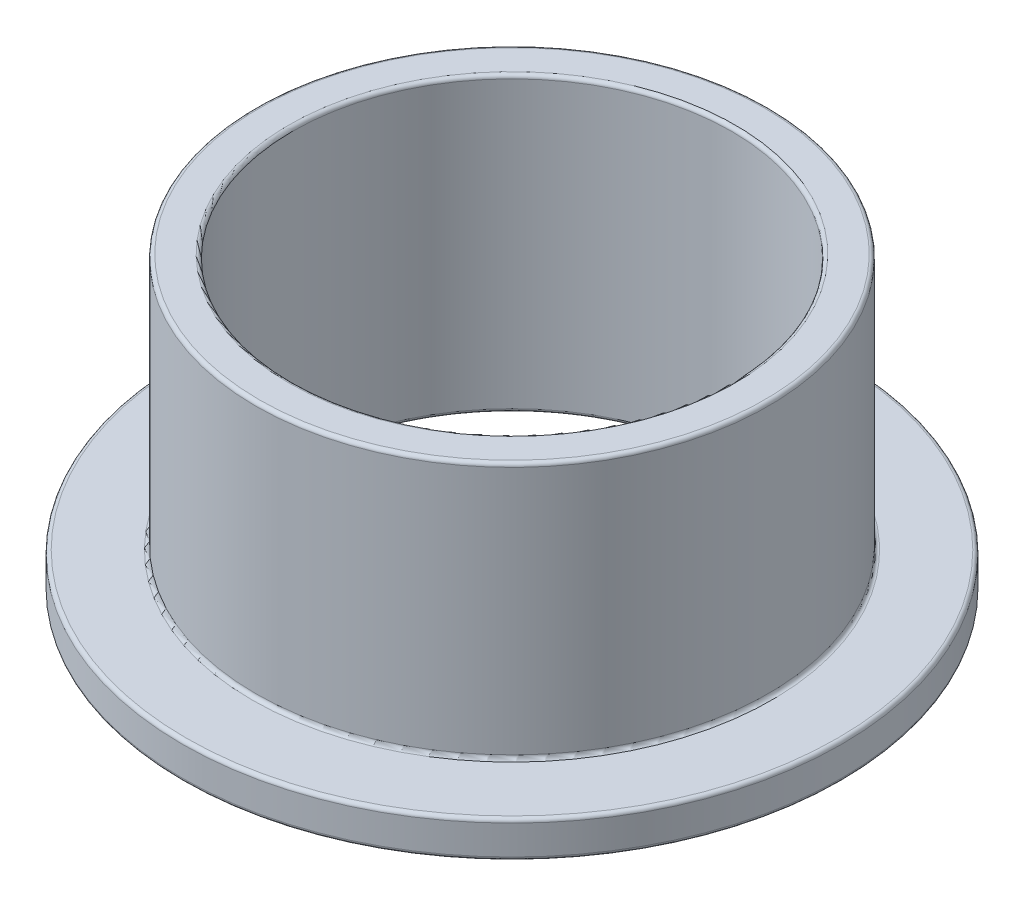
ISO-10303-21;
HEADER;
FILE_DESCRIPTION(('STEP AP214'),'2;1');
FILE_NAME('part.step','',(''),(''),'','','');
FILE_SCHEMA(('AUTOMOTIVE_DESIGN { 1 0 10303 214 1 1 1 1 }'));
ENDSEC;
DATA;
#1=APPLICATION_CONTEXT('core data for automotive mechanical design processes');
#2=APPLICATION_PROTOCOL_DEFINITION('international standard','automotive_design',2000,#1);
#3=PRODUCT_CONTEXT('',#1,'mechanical');
#4=PRODUCT('Part','Part','',(#3));
#5=PRODUCT_RELATED_PRODUCT_CATEGORY('part','',(#4));
#6=PRODUCT_DEFINITION_FORMATION('','',#4);
#7=PRODUCT_DEFINITION_CONTEXT('part definition',#1,'design');
#8=PRODUCT_DEFINITION('design','',#6,#7);
#9=PRODUCT_DEFINITION_SHAPE('','',#8);
#10=(LENGTH_UNIT() NAMED_UNIT(*) SI_UNIT(.MILLI.,.METRE.));
#11=(NAMED_UNIT(*) PLANE_ANGLE_UNIT() SI_UNIT($,.RADIAN.));
#12=(NAMED_UNIT(*) SI_UNIT($,.STERADIAN.) SOLID_ANGLE_UNIT());
#13=UNCERTAINTY_MEASURE_WITH_UNIT(LENGTH_MEASURE(1.E-05),#10,'distance_accuracy_value','');
#14=(GEOMETRIC_REPRESENTATION_CONTEXT(3) GLOBAL_UNCERTAINTY_ASSIGNED_CONTEXT((#13)) GLOBAL_UNIT_ASSIGNED_CONTEXT((#10,
#11,#12)) REPRESENTATION_CONTEXT('',''));
#15=CARTESIAN_POINT('',(0.,0.,0.));
#16=DIRECTION('',(0.,0.,1.));
#17=DIRECTION('',(1.,0.,0.));
#18=AXIS2_PLACEMENT_3D('',#15,#16,#17);
#19=CARTESIAN_POINT('',(0.,12.7,0.));
#20=DIRECTION('',(0.,1.,0.));
#21=DIRECTION('',(0.,0.,1.));
#22=AXIS2_PLACEMENT_3D('',#19,#20,#21);
#23=PLANE('',#22);
#24=CARTESIAN_POINT('',(0.,12.7,0.));
#25=DIRECTION('',(0.,1.,0.));
#26=DIRECTION('',(0.,0.,1.));
#27=AXIS2_PLACEMENT_3D('',#24,#25,#26);
#28=CIRCLE('',#27,9.68375);
#29=CARTESIAN_POINT('',(0.,12.7,9.68375));
#30=VERTEX_POINT('',#29);
#31=EDGE_CURVE('E10',#30,#30,#28,.F.);
#32=ORIENTED_EDGE('',*,*,#31,.T.);
#33=EDGE_LOOP('',(#32));
#34=FACE_BOUND('',#33,.T.);
#35=CARTESIAN_POINT('',(0.,12.7,0.));
#36=DIRECTION('',(0.,1.,0.));
#37=DIRECTION('',(0.,0.,1.));
#38=AXIS2_PLACEMENT_3D('',#35,#36,#37);
#39=CIRCLE('',#38,10.95375);
#40=CARTESIAN_POINT('',(0.,12.7,10.95375));
#41=VERTEX_POINT('',#40);
#42=EDGE_CURVE('E42',#41,#41,#39,.T.);
#43=ORIENTED_EDGE('',*,*,#42,.T.);
#44=EDGE_LOOP('',(#43));
#45=FACE_BOUND('',#44,.T.);
#46=ADVANCED_FACE('F35',(#34,#45),#23,.T.);
#47=CARTESIAN_POINT('',(0.,0.,0.));
#48=DIRECTION('',(0.,1.,0.));
#49=DIRECTION('',(0.,0.,1.));
#50=AXIS2_PLACEMENT_3D('',#47,#48,#49);
#51=PLANE('',#50);
#52=CARTESIAN_POINT('',(0.,0.,0.));
#53=DIRECTION('',(0.,1.,0.));
#54=DIRECTION('',(0.,0.,1.));
#55=AXIS2_PLACEMENT_3D('',#52,#53,#54);
#56=CIRCLE('',#55,9.68375);
#57=CARTESIAN_POINT('',(0.,0.,9.68375));
#58=VERTEX_POINT('',#57);
#59=EDGE_CURVE('E73',#58,#58,#56,.T.);
#60=ORIENTED_EDGE('',*,*,#59,.T.);
#61=EDGE_LOOP('',(#60));
#62=FACE_BOUND('',#61,.T.);
#63=CARTESIAN_POINT('',(0.,0.,0.));
#64=DIRECTION('',(0.,1.,0.));
#65=DIRECTION('',(0.,0.,1.));
#66=AXIS2_PLACEMENT_3D('',#63,#64,#65);
#67=CIRCLE('',#66,14.12875);
#68=CARTESIAN_POINT('',(0.,0.,14.12875));
#69=VERTEX_POINT('',#68);
#70=EDGE_CURVE('E76',#69,#69,#67,.F.);
#71=ORIENTED_EDGE('',*,*,#70,.T.);
#72=EDGE_LOOP('',(#71));
#73=FACE_BOUND('',#72,.T.);
#74=ADVANCED_FACE('F80',(#62,#73),#51,.F.);
#75=CARTESIAN_POINT('',(0.,12.7,0.));
#76=DIRECTION('',(0.,-1.,0.));
#77=DIRECTION('',(0.,0.,-1.));
#78=AXIS2_PLACEMENT_3D('',#75,#76,#77);
#79=CYLINDRICAL_SURFACE('',#78,11.1125);
#80=CARTESIAN_POINT('',(0.,1.74625,0.));
#81=DIRECTION('',(0.,1.,0.));
#82=DIRECTION('',(0.,0.,1.));
#83=AXIS2_PLACEMENT_3D('',#80,#81,#82);
#84=CIRCLE('',#83,11.1125);
#85=CARTESIAN_POINT('',(0.,1.74625,11.1125));
#86=VERTEX_POINT('',#85);
#87=EDGE_CURVE('E55',#86,#86,#84,.T.);
#88=ORIENTED_EDGE('',*,*,#87,.T.);
#89=EDGE_LOOP('',(#88));
#90=FACE_BOUND('',#89,.T.);
#91=CARTESIAN_POINT('',(0.,12.54125,0.));
#92=DIRECTION('',(0.,1.,0.));
#93=DIRECTION('',(0.,0.,1.));
#94=AXIS2_PLACEMENT_3D('',#91,#92,#93);
#95=CIRCLE('',#94,11.1125);
#96=CARTESIAN_POINT('',(0.,12.54125,11.1125));
#97=VERTEX_POINT('',#96);
#98=EDGE_CURVE('E58',#97,#97,#95,.F.);
#99=ORIENTED_EDGE('',*,*,#98,.T.);
#100=EDGE_LOOP('',(#99));
#101=FACE_BOUND('',#100,.T.);
#102=ADVANCED_FACE('F111',(#90,#101),#79,.T.);
#103=CARTESIAN_POINT('',(0.,12.7,0.));
#104=DIRECTION('',(0.,-1.,0.));
#105=DIRECTION('',(0.,0.,-1.));
#106=AXIS2_PLACEMENT_3D('',#103,#104,#105);
#107=CYLINDRICAL_SURFACE('',#106,9.525);
#108=CARTESIAN_POINT('',(0.,0.158749999999999,0.));
#109=DIRECTION('',(0.,1.,0.));
#110=DIRECTION('',(0.,0.,1.));
#111=AXIS2_PLACEMENT_3D('',#108,#109,#110);
#112=CIRCLE('',#111,9.525);
#113=CARTESIAN_POINT('',(0.,0.158749999999999,9.525));
#114=VERTEX_POINT('',#113);
#115=EDGE_CURVE('E67',#114,#114,#112,.F.);
#116=ORIENTED_EDGE('',*,*,#115,.T.);
#117=EDGE_LOOP('',(#116));
#118=FACE_BOUND('',#117,.T.);
#119=CARTESIAN_POINT('',(0.,12.54125,0.));
#120=DIRECTION('',(0.,1.,0.));
#121=DIRECTION('',(0.,0.,1.));
#122=AXIS2_PLACEMENT_3D('',#119,#120,#121);
#123=CIRCLE('',#122,9.525);
#124=CARTESIAN_POINT('',(0.,12.54125,9.525));
#125=VERTEX_POINT('',#124);
#126=EDGE_CURVE('E70',#125,#125,#123,.T.);
#127=ORIENTED_EDGE('',*,*,#126,.T.);
#128=EDGE_LOOP('',(#127));
#129=FACE_BOUND('',#128,.T.);
#130=ADVANCED_FACE('F105',(#118,#129),#107,.F.);
#131=CARTESIAN_POINT('',(0.,1.5875,0.));
#132=DIRECTION('',(0.,1.,0.));
#133=DIRECTION('',(0.,0.,1.));
#134=AXIS2_PLACEMENT_3D('',#131,#132,#133);
#135=PLANE('',#134);
#136=CARTESIAN_POINT('',(0.,1.5875,0.));
#137=DIRECTION('',(0.,1.,0.));
#138=DIRECTION('',(0.,0.,1.));
#139=AXIS2_PLACEMENT_3D('',#136,#137,#138);
#140=CIRCLE('',#139,11.27125);
#141=CARTESIAN_POINT('',(0.,1.5875,11.27125));
#142=VERTEX_POINT('',#141);
#143=EDGE_CURVE('E46',#142,#142,#140,.F.);
#144=ORIENTED_EDGE('',*,*,#143,.T.);
#145=EDGE_LOOP('',(#144));
#146=FACE_BOUND('',#145,.T.);
#147=CARTESIAN_POINT('',(0.,1.5875,0.));
#148=DIRECTION('',(0.,1.,0.));
#149=DIRECTION('',(0.,0.,1.));
#150=AXIS2_PLACEMENT_3D('',#147,#148,#149);
#151=CIRCLE('',#150,14.12875);
#152=CARTESIAN_POINT('',(0.,1.5875,14.12875));
#153=VERTEX_POINT('',#152);
#154=EDGE_CURVE('E50',#153,#153,#151,.T.);
#155=ORIENTED_EDGE('',*,*,#154,.T.);
#156=EDGE_LOOP('',(#155));
#157=FACE_BOUND('',#156,.T.);
#158=ADVANCED_FACE('F93',(#146,#157),#135,.T.);
#159=CARTESIAN_POINT('',(0.,1.5875,0.));
#160=DIRECTION('',(0.,-1.,0.));
#161=DIRECTION('',(0.,0.,-1.));
#162=AXIS2_PLACEMENT_3D('',#159,#160,#161);
#163=CYLINDRICAL_SURFACE('',#162,14.2875);
#164=CARTESIAN_POINT('',(0.,0.15875,0.));
#165=DIRECTION('',(0.,1.,0.));
#166=DIRECTION('',(0.,0.,1.));
#167=AXIS2_PLACEMENT_3D('',#164,#165,#166);
#168=CIRCLE('',#167,14.2875);
#169=CARTESIAN_POINT('',(0.,0.15875,14.2875));
#170=VERTEX_POINT('',#169);
#171=EDGE_CURVE('E61',#170,#170,#168,.T.);
#172=ORIENTED_EDGE('',*,*,#171,.T.);
#173=EDGE_LOOP('',(#172));
#174=FACE_BOUND('',#173,.T.);
#175=CARTESIAN_POINT('',(0.,1.42875,0.));
#176=DIRECTION('',(0.,1.,0.));
#177=DIRECTION('',(0.,0.,1.));
#178=AXIS2_PLACEMENT_3D('',#175,#176,#177);
#179=CIRCLE('',#178,14.2875);
#180=CARTESIAN_POINT('',(0.,1.42875,14.2875));
#181=VERTEX_POINT('',#180);
#182=EDGE_CURVE('E64',#181,#181,#179,.F.);
#183=ORIENTED_EDGE('',*,*,#182,.T.);
#184=EDGE_LOOP('',(#183));
#185=FACE_BOUND('',#184,.T.);
#186=ADVANCED_FACE('F90',(#174,#185),#163,.T.);
#187=CARTESIAN_POINT('',(0.,0.158749999999999,0.));
#188=DIRECTION('',(0.,1.,0.));
#189=DIRECTION('',(0.,0.,1.));
#190=AXIS2_PLACEMENT_3D('',#187,#188,#189);
#191=TOROIDAL_SURFACE('',#190,9.68375,0.15875);
#192=ORIENTED_EDGE('',*,*,#115,.F.);
#193=EDGE_LOOP('',(#192));
#194=FACE_BOUND('',#193,.T.);
#195=ORIENTED_EDGE('',*,*,#59,.F.);
#196=EDGE_LOOP('',(#195));
#197=FACE_BOUND('',#196,.T.);
#198=ADVANCED_FACE('F86',(#194,#197),#191,.T.);
#199=CARTESIAN_POINT('',(0.,0.15875,0.));
#200=DIRECTION('',(0.,1.,0.));
#201=DIRECTION('',(0.,0.,1.));
#202=AXIS2_PLACEMENT_3D('',#199,#200,#201);
#203=TOROIDAL_SURFACE('',#202,14.12875,0.15875);
#204=ORIENTED_EDGE('',*,*,#70,.F.);
#205=EDGE_LOOP('',(#204));
#206=FACE_BOUND('',#205,.T.);
#207=ORIENTED_EDGE('',*,*,#171,.F.);
#208=EDGE_LOOP('',(#207));
#209=FACE_BOUND('',#208,.T.);
#210=ADVANCED_FACE('F82',(#206,#209),#203,.T.);
#211=CARTESIAN_POINT('',(0.,1.74625,0.));
#212=DIRECTION('',(0.,1.,0.));
#213=DIRECTION('',(0.,0.,1.));
#214=AXIS2_PLACEMENT_3D('',#211,#212,#213);
#215=TOROIDAL_SURFACE('',#214,11.27125,0.15875);
#216=ORIENTED_EDGE('',*,*,#143,.F.);
#217=EDGE_LOOP('',(#216));
#218=FACE_BOUND('',#217,.T.);
#219=ORIENTED_EDGE('',*,*,#87,.F.);
#220=EDGE_LOOP('',(#219));
#221=FACE_BOUND('',#220,.T.);
#222=ADVANCED_FACE('F85',(#218,#221),#215,.F.);
#223=CARTESIAN_POINT('',(0.,1.42875,0.));
#224=DIRECTION('',(0.,1.,0.));
#225=DIRECTION('',(0.,0.,1.));
#226=AXIS2_PLACEMENT_3D('',#223,#224,#225);
#227=TOROIDAL_SURFACE('',#226,14.12875,0.15875);
#228=ORIENTED_EDGE('',*,*,#182,.F.);
#229=EDGE_LOOP('',(#228));
#230=FACE_BOUND('',#229,.T.);
#231=ORIENTED_EDGE('',*,*,#154,.F.);
#232=EDGE_LOOP('',(#231));
#233=FACE_BOUND('',#232,.T.);
#234=ADVANCED_FACE('F97',(#230,#233),#227,.T.);
#235=CARTESIAN_POINT('',(0.,12.54125,0.));
#236=DIRECTION('',(0.,1.,0.));
#237=DIRECTION('',(0.,0.,1.));
#238=AXIS2_PLACEMENT_3D('',#235,#236,#237);
#239=TOROIDAL_SURFACE('',#238,9.68375,0.15875);
#240=ORIENTED_EDGE('',*,*,#31,.F.);
#241=EDGE_LOOP('',(#240));
#242=FACE_BOUND('',#241,.T.);
#243=ORIENTED_EDGE('',*,*,#126,.F.);
#244=EDGE_LOOP('',(#243));
#245=FACE_BOUND('',#244,.T.);
#246=ADVANCED_FACE('F100',(#242,#245),#239,.T.);
#247=CARTESIAN_POINT('',(0.,12.54125,0.));
#248=DIRECTION('',(0.,1.,0.));
#249=DIRECTION('',(0.,0.,1.));
#250=AXIS2_PLACEMENT_3D('',#247,#248,#249);
#251=TOROIDAL_SURFACE('',#250,10.95375,0.15875);
#252=ORIENTED_EDGE('',*,*,#98,.F.);
#253=EDGE_LOOP('',(#252));
#254=FACE_BOUND('',#253,.T.);
#255=ORIENTED_EDGE('',*,*,#42,.F.);
#256=EDGE_LOOP('',(#255));
#257=FACE_BOUND('',#256,.T.);
#258=ADVANCED_FACE('F37',(#254,#257),#251,.T.);
#259=CLOSED_SHELL('',(#46,#74,#102,#130,#158,#186,#198,#210,#222,#234,#246,#258));
#260=MANIFOLD_SOLID_BREP('B2',#259);
#261=ADVANCED_BREP_SHAPE_REPRESENTATION('',(#18,#260),#14);
#262=SHAPE_DEFINITION_REPRESENTATION(#9,#261);
ENDSEC;
END-ISO-10303-21;
